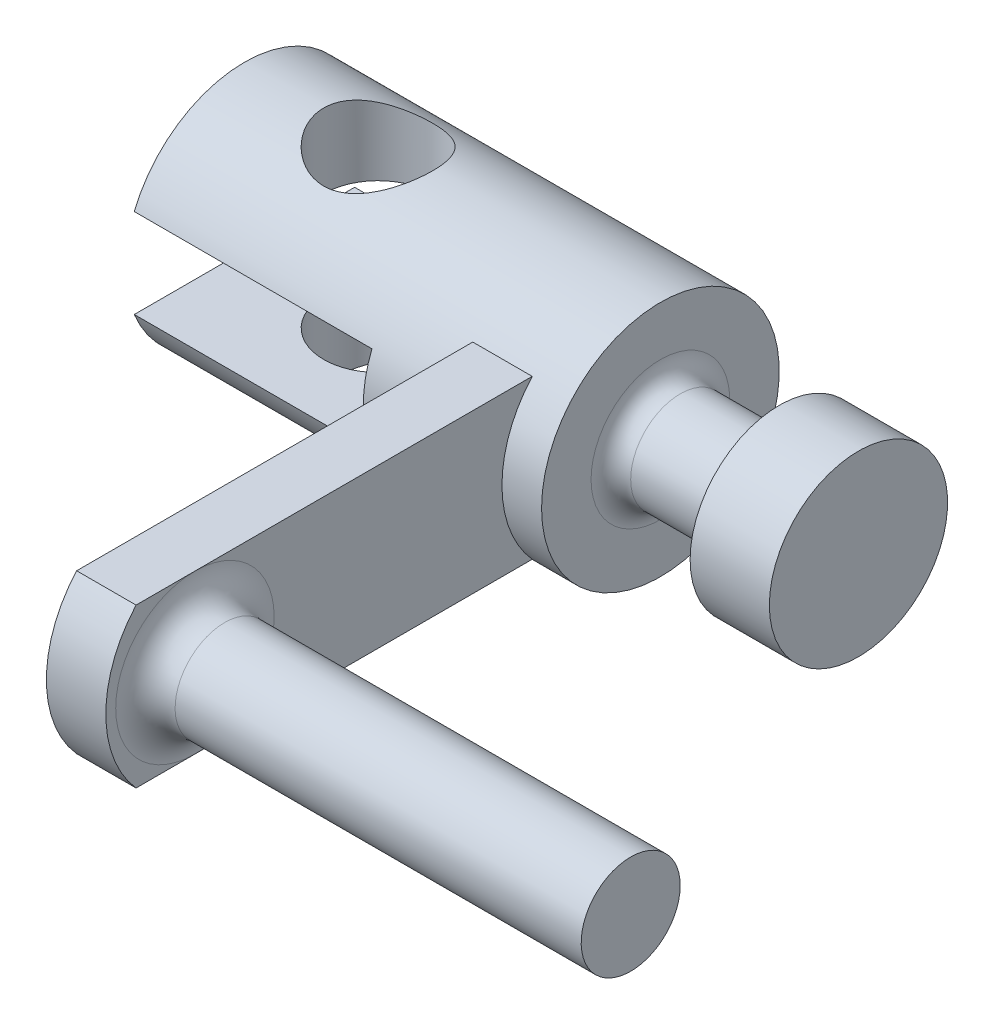
ISO-10303-21;
HEADER;
FILE_DESCRIPTION(('STEP AP214'),'2;1');
FILE_NAME('part.step','',(''),(''),'','','');
FILE_SCHEMA(('AUTOMOTIVE_DESIGN { 1 0 10303 214 1 1 1 1 }'));
ENDSEC;
DATA;
#1=APPLICATION_CONTEXT('core data for automotive mechanical design processes');
#2=APPLICATION_PROTOCOL_DEFINITION('international standard','automotive_design',2000,#1);
#3=PRODUCT_CONTEXT('',#1,'mechanical');
#4=PRODUCT('Part','Part','',(#3));
#5=PRODUCT_RELATED_PRODUCT_CATEGORY('part','',(#4));
#6=PRODUCT_DEFINITION_FORMATION('','',#4);
#7=PRODUCT_DEFINITION_CONTEXT('part definition',#1,'design');
#8=PRODUCT_DEFINITION('design','',#6,#7);
#9=PRODUCT_DEFINITION_SHAPE('','',#8);
#10=(LENGTH_UNIT() NAMED_UNIT(*) SI_UNIT(.MILLI.,.METRE.));
#11=(NAMED_UNIT(*) PLANE_ANGLE_UNIT() SI_UNIT($,.RADIAN.));
#12=(NAMED_UNIT(*) SI_UNIT($,.STERADIAN.) SOLID_ANGLE_UNIT());
#13=UNCERTAINTY_MEASURE_WITH_UNIT(LENGTH_MEASURE(1.E-05),#10,'distance_accuracy_value','');
#14=(GEOMETRIC_REPRESENTATION_CONTEXT(3) GLOBAL_UNCERTAINTY_ASSIGNED_CONTEXT((#13)) GLOBAL_UNIT_ASSIGNED_CONTEXT((#10,
#11,#12)) REPRESENTATION_CONTEXT('',''));
#15=CARTESIAN_POINT('',(0.,0.,0.));
#16=DIRECTION('',(0.,0.,1.));
#17=DIRECTION('',(1.,0.,0.));
#18=AXIS2_PLACEMENT_3D('',#15,#16,#17);
#19=CARTESIAN_POINT('',(-12.,4.,4.47213595499958));
#20=DIRECTION('',(1.,0.,0.));
#21=DIRECTION('',(0.,1.,0.));
#22=AXIS2_PLACEMENT_3D('',#19,#20,#21);
#23=PLANE('',#22);
#24=DIRECTION('',(0.,0.,1.));
#25=VECTOR('',#24,1.);
#26=CARTESIAN_POINT('',(-12.,-4.,4.47213595499958));
#27=LINE('',#26,#25);
#28=CARTESIAN_POINT('',(-12.,-4.,21.5));
#29=VERTEX_POINT('',#28);
#30=CARTESIAN_POINT('',(-12.,-4.,24.4721359549996));
#31=VERTEX_POINT('',#30);
#32=EDGE_CURVE('E129',#29,#31,#27,.T.);
#33=ORIENTED_EDGE('',*,*,#32,.F.);
#34=CARTESIAN_POINT('',(-12.,0.,21.5));
#35=DIRECTION('',(1.,0.,0.));
#36=DIRECTION('',(0.,1.,0.));
#37=AXIS2_PLACEMENT_3D('',#34,#35,#36);
#38=CIRCLE('',#37,4.);
#39=CARTESIAN_POINT('',(-12.,4.,21.5));
#40=VERTEX_POINT('',#39);
#41=EDGE_CURVE('E11',#29,#40,#38,.F.);
#42=ORIENTED_EDGE('',*,*,#41,.T.);
#43=DIRECTION('',(0.,0.,1.));
#44=VECTOR('',#43,1.);
#45=CARTESIAN_POINT('',(-12.,4.,4.47213595499958));
#46=LINE('',#45,#44);
#47=CARTESIAN_POINT('',(-12.,3.99999999999999,24.4721359549996));
#48=VERTEX_POINT('',#47);
#49=EDGE_CURVE('E122',#40,#48,#46,.T.);
#50=ORIENTED_EDGE('',*,*,#49,.T.);
#51=CARTESIAN_POINT('',(-12.,0.,20.));
#52=DIRECTION('',(-1.,0.,0.));
#53=DIRECTION('',(0.,-1.,0.));
#54=AXIS2_PLACEMENT_3D('',#51,#52,#53);
#55=CIRCLE('',#54,6.);
#56=EDGE_CURVE('E162',#31,#48,#55,.T.);
#57=ORIENTED_EDGE('',*,*,#56,.F.);
#58=EDGE_LOOP('',(#33,#42,#50,#57));
#59=FACE_BOUND('',#58,.T.);
#60=ADVANCED_FACE('F43',(#59),#23,.T.);
#61=CARTESIAN_POINT('',(-31.,0.,-6.));
#62=DIRECTION('',(1.,0.,0.));
#63=DIRECTION('',(0.,0.,-1.));
#64=AXIS2_PLACEMENT_3D('',#61,#62,#63);
#65=PLANE('',#64);
#66=CARTESIAN_POINT('',(-31.,0.,0.));
#67=DIRECTION('',(-1.,0.,0.));
#68=DIRECTION('',(0.,0.,1.));
#69=AXIS2_PLACEMENT_3D('',#66,#67,#68);
#70=CIRCLE('',#69,6.);
#71=CARTESIAN_POINT('',(-31.,-2.25,-5.56214886532175));
#72=VERTEX_POINT('',#71);
#73=CARTESIAN_POINT('',(-31.,-2.25,5.56214886532174));
#74=VERTEX_POINT('',#73);
#75=EDGE_CURVE('E521',#72,#74,#70,.T.);
#76=ORIENTED_EDGE('',*,*,#75,.T.);
#77=DIRECTION('',(0.,0.,-1.));
#78=VECTOR('',#77,1.);
#79=CARTESIAN_POINT('',(-31.,-2.25,-6.));
#80=LINE('',#79,#78);
#81=EDGE_CURVE('E475',#74,#72,#80,.T.);
#82=ORIENTED_EDGE('',*,*,#81,.T.);
#83=EDGE_LOOP('',(#76,#82));
#84=FACE_BOUND('',#83,.T.);
#85=ADVANCED_FACE('F217',(#84),#65,.F.);
#86=CARTESIAN_POINT('',(0.,0.,0.));
#87=DIRECTION('',(-1.,0.,0.));
#88=DIRECTION('',(0.,0.,1.));
#89=AXIS2_PLACEMENT_3D('',#86,#87,#88);
#90=PLANE('',#89);
#91=CARTESIAN_POINT('',(0.,0.,0.));
#92=DIRECTION('',(-1.,0.,0.));
#93=DIRECTION('',(0.,0.,1.));
#94=AXIS2_PLACEMENT_3D('',#91,#92,#93);
#95=CIRCLE('',#94,4.5);
#96=CARTESIAN_POINT('',(0.,0.,4.5));
#97=VERTEX_POINT('',#96);
#98=EDGE_CURVE('E466',#97,#97,#95,.T.);
#99=ORIENTED_EDGE('',*,*,#98,.F.);
#100=EDGE_LOOP('',(#99));
#101=FACE_BOUND('',#100,.T.);
#102=ADVANCED_FACE('F224',(#101),#90,.F.);
#103=CARTESIAN_POINT('',(-13.3084677419355,0.,0.));
#104=DIRECTION('',(-1.,0.,0.));
#105=DIRECTION('',(0.,0.,1.));
#106=AXIS2_PLACEMENT_3D('',#103,#104,#105);
#107=CYLINDRICAL_SURFACE('',#106,4.5);
#108=CARTESIAN_POINT('',(-4.,0.,0.));
#109=DIRECTION('',(-1.,0.,0.));
#110=DIRECTION('',(0.,0.,1.));
#111=AXIS2_PLACEMENT_3D('',#108,#109,#110);
#112=CIRCLE('',#111,4.5);
#113=CARTESIAN_POINT('',(-4.,0.,4.5));
#114=VERTEX_POINT('',#113);
#115=EDGE_CURVE('E470',#114,#114,#112,.T.);
#116=ORIENTED_EDGE('',*,*,#115,.F.);
#117=EDGE_LOOP('',(#116));
#118=FACE_BOUND('',#117,.T.);
#119=ORIENTED_EDGE('',*,*,#98,.T.);
#120=EDGE_LOOP('',(#119));
#121=FACE_BOUND('',#120,.T.);
#122=ADVANCED_FACE('F433',(#118,#121),#107,.T.);
#123=CARTESIAN_POINT('',(-4.,0.,-4.5));
#124=DIRECTION('',(1.,0.,0.));
#125=DIRECTION('',(0.,0.,-1.));
#126=AXIS2_PLACEMENT_3D('',#123,#124,#125);
#127=PLANE('',#126);
#128=CARTESIAN_POINT('',(-4.,0.,0.));
#129=DIRECTION('',(-1.,0.,0.));
#130=DIRECTION('',(0.,0.,1.));
#131=AXIS2_PLACEMENT_3D('',#128,#129,#130);
#132=CIRCLE('',#131,2.5);
#133=CARTESIAN_POINT('',(-4.,0.,2.5));
#134=VERTEX_POINT('',#133);
#135=EDGE_CURVE('E478',#134,#134,#132,.T.);
#136=ORIENTED_EDGE('',*,*,#135,.F.);
#137=EDGE_LOOP('',(#136));
#138=FACE_BOUND('',#137,.T.);
#139=ORIENTED_EDGE('',*,*,#115,.T.);
#140=EDGE_LOOP('',(#139));
#141=FACE_BOUND('',#140,.T.);
#142=ADVANCED_FACE('F321',(#138,#141),#127,.F.);
#143=CARTESIAN_POINT('',(-13.3084677419355,0.,0.));
#144=DIRECTION('',(-1.,0.,0.));
#145=DIRECTION('',(0.,0.,1.));
#146=AXIS2_PLACEMENT_3D('',#143,#144,#145);
#147=CYLINDRICAL_SURFACE('',#146,2.5);
#148=CARTESIAN_POINT('',(-9.,0.,0.));
#149=DIRECTION('',(-1.,0.,0.));
#150=DIRECTION('',(0.,0.,1.));
#151=AXIS2_PLACEMENT_3D('',#148,#149,#150);
#152=CIRCLE('',#151,2.5);
#153=CARTESIAN_POINT('',(-9.,0.,2.5));
#154=VERTEX_POINT('',#153);
#155=EDGE_CURVE('E493',#154,#154,#152,.F.);
#156=ORIENTED_EDGE('',*,*,#155,.T.);
#157=EDGE_LOOP('',(#156));
#158=FACE_BOUND('',#157,.T.);
#159=ORIENTED_EDGE('',*,*,#135,.T.);
#160=EDGE_LOOP('',(#159));
#161=FACE_BOUND('',#160,.T.);
#162=ADVANCED_FACE('F317',(#158,#161),#147,.T.);
#163=CARTESIAN_POINT('',(-10.,0.,-2.5));
#164=DIRECTION('',(-1.,0.,0.));
#165=DIRECTION('',(0.,0.,1.));
#166=AXIS2_PLACEMENT_3D('',#163,#164,#165);
#167=PLANE('',#166);
#168=CARTESIAN_POINT('',(-10.,0.,0.));
#169=DIRECTION('',(-1.,0.,0.));
#170=DIRECTION('',(0.,0.,1.));
#171=AXIS2_PLACEMENT_3D('',#168,#169,#170);
#172=CIRCLE('',#171,3.5);
#173=CARTESIAN_POINT('',(-10.,0.,3.5));
#174=VERTEX_POINT('',#173);
#175=EDGE_CURVE('E489',#174,#174,#172,.T.);
#176=ORIENTED_EDGE('',*,*,#175,.T.);
#177=EDGE_LOOP('',(#176));
#178=FACE_BOUND('',#177,.T.);
#179=CARTESIAN_POINT('',(-10.,0.,0.));
#180=DIRECTION('',(-1.,0.,0.));
#181=DIRECTION('',(0.,0.,1.));
#182=AXIS2_PLACEMENT_3D('',#179,#180,#181);
#183=CIRCLE('',#182,6.);
#184=CARTESIAN_POINT('',(-10.,0.,6.));
#185=VERTEX_POINT('',#184);
#186=EDGE_CURVE('E534',#185,#185,#183,.T.);
#187=ORIENTED_EDGE('',*,*,#186,.F.);
#188=EDGE_LOOP('',(#187));
#189=FACE_BOUND('',#188,.T.);
#190=ADVANCED_FACE('F221',(#178,#189),#167,.F.);
#191=CARTESIAN_POINT('',(-13.3084677419355,0.,0.));
#192=DIRECTION('',(-1.,0.,0.));
#193=DIRECTION('',(0.,0.,1.));
#194=AXIS2_PLACEMENT_3D('',#191,#192,#193);
#195=CYLINDRICAL_SURFACE('',#194,6.);
#196=DIRECTION('',(-1.,0.,0.));
#197=VECTOR('',#196,1.);
#198=CARTESIAN_POINT('',(-13.3084677419355,4.,4.47213595499958));
#199=LINE('',#198,#197);
#200=CARTESIAN_POINT('',(-12.,4.,4.47213595499958));
#201=VERTEX_POINT('',#200);
#202=CARTESIAN_POINT('',(-15.,3.99999999999999,4.47213595499958));
#203=VERTEX_POINT('',#202);
#204=EDGE_CURVE('E119',#201,#203,#199,.T.);
#205=ORIENTED_EDGE('',*,*,#204,.F.);
#206=CARTESIAN_POINT('',(-12.,0.,0.));
#207=DIRECTION('',(-1.,0.,0.));
#208=DIRECTION('',(0.,-1.,0.));
#209=AXIS2_PLACEMENT_3D('',#206,#207,#208);
#210=CIRCLE('',#209,6.);
#211=CARTESIAN_POINT('',(-12.,-4.,4.47213595499958));
#212=VERTEX_POINT('',#211);
#213=EDGE_CURVE('E112',#212,#201,#210,.T.);
#214=ORIENTED_EDGE('',*,*,#213,.F.);
#215=DIRECTION('',(-1.,0.,0.));
#216=VECTOR('',#215,1.);
#217=CARTESIAN_POINT('',(-13.3084677419355,-4.,4.47213595499958));
#218=LINE('',#217,#216);
#219=CARTESIAN_POINT('',(-15.,-4.,4.47213595499958));
#220=VERTEX_POINT('',#219);
#221=EDGE_CURVE('E116',#212,#220,#218,.T.);
#222=ORIENTED_EDGE('',*,*,#221,.T.);
#223=CARTESIAN_POINT('',(-15.,0.,0.));
#224=DIRECTION('',(1.,0.,0.));
#225=DIRECTION('',(0.,0.,-1.));
#226=AXIS2_PLACEMENT_3D('',#223,#224,#225);
#227=CIRCLE('',#226,6.);
#228=EDGE_CURVE('E149',#203,#220,#227,.T.);
#229=ORIENTED_EDGE('',*,*,#228,.F.);
#230=EDGE_LOOP('',(#205,#214,#222,#229));
#231=FACE_BOUND('',#230,.T.);
#232=CARTESIAN_POINT('',(-27.,-6.,0.));
#233=CARTESIAN_POINT('',(-26.9999912961116,-5.99999285624569,0.145974227100079));
#234=CARTESIAN_POINT('',(-26.9883079687476,-5.99461344969342,0.292168614341585));
#235=CARTESIAN_POINT('',(-26.9420475155607,-5.97362621907722,0.580321879872874));
#236=CARTESIAN_POINT('',(-26.9074180122934,-5.95799499482463,0.722270289630445));
#237=CARTESIAN_POINT('',(-26.8168554693923,-5.91815898458901,0.997313063866765));
#238=CARTESIAN_POINT('',(-26.7610002518078,-5.89398554026955,1.13043771039469));
#239=CARTESIAN_POINT('',(-26.6299318945222,-5.83935231640849,1.38526949285144));
#240=CARTESIAN_POINT('',(-26.5547224374408,-5.80889373298723,1.50697879482536));
#241=CARTESIAN_POINT('',(-26.3824870751646,-5.74267808763627,1.74282567672531));
#242=CARTESIAN_POINT('',(-26.2845127594333,-5.70672525701042,1.85621502873833));
#243=CARTESIAN_POINT('',(-26.0715480891655,-5.63431549221796,2.06562060716264));
#244=CARTESIAN_POINT('',(-25.9565470241305,-5.59785825394064,2.16162581313924));
#245=CARTESIAN_POINT('',(-25.7041448867514,-5.52598652132146,2.33949763387027));
#246=CARTESIAN_POINT('',(-25.5657942846685,-5.49077874162965,2.42010961946554));
#247=CARTESIAN_POINT('',(-25.2756748974778,-5.42858377774875,2.55658829345862));
#248=CARTESIAN_POINT('',(-25.1239144757049,-5.40159151581228,2.61247027641269));
#249=CARTESIAN_POINT('',(-24.8198559071101,-5.36104741962166,2.69465764507304));
#250=CARTESIAN_POINT('',(-24.6680407507441,-5.34684146569753,2.72241297665656));
#251=CARTESIAN_POINT('',(-24.3612960767505,-5.33165081426984,2.75205526971009));
#252=CARTESIAN_POINT('',(-24.2063689338031,-5.3306563925384,2.75396125737568));
#253=CARTESIAN_POINT('',(-23.9138037247483,-5.34145986948393,2.73292718459751));
#254=CARTESIAN_POINT('',(-23.775939454173,-5.35203309817852,2.71236599181203));
#255=CARTESIAN_POINT('',(-23.5058919277998,-5.38267392029549,2.65103453596601));
#256=CARTESIAN_POINT('',(-23.3737100678864,-5.40274383220447,2.61025933781386));
#257=CARTESIAN_POINT('',(-23.1151462484286,-5.45058234155423,2.5088530409151));
#258=CARTESIAN_POINT('',(-22.9889660474083,-5.47851649850035,2.44778919683436));
#259=CARTESIAN_POINT('',(-22.7480901622206,-5.53891779292472,2.30785393809594));
#260=CARTESIAN_POINT('',(-22.6333994663275,-5.57138688476546,2.22897483673399));
#261=CARTESIAN_POINT('',(-22.406164694757,-5.64130676856698,2.04602125851287));
#262=CARTESIAN_POINT('',(-22.2950921827368,-5.67892393650109,1.94017698629255));
#263=CARTESIAN_POINT('',(-22.0917215169422,-5.75209970703169,1.71108285967776));
#264=CARTESIAN_POINT('',(-21.9994297677068,-5.78765760443676,1.58782709188083));
#265=CARTESIAN_POINT('',(-21.8334326385591,-5.85417071036373,1.32213023021257));
#266=CARTESIAN_POINT('',(-21.7604469767293,-5.88493365620428,1.17918763034504));
#267=CARTESIAN_POINT('',(-21.6400952679497,-5.93684579662981,0.881280922866591));
#268=CARTESIAN_POINT('',(-21.5927120406373,-5.958001436616,0.72632495679525));
#269=CARTESIAN_POINT('',(-21.5282695961487,-5.98703237694658,0.42097675257108));
#270=CARTESIAN_POINT('',(-21.5092433059414,-5.99576698376909,0.271081706964737));
#271=CARTESIAN_POINT('',(-21.4960426343062,-6.00181121374038,-0.0300061640852818));
#272=CARTESIAN_POINT('',(-21.5018590772941,-5.99912505511416,-0.181198489794864));
#273=CARTESIAN_POINT('',(-21.5368876847648,-5.98316536241069,-0.470567421119453));
#274=CARTESIAN_POINT('',(-21.5646114006939,-5.9705656149117,-0.608966058558463));
#275=CARTESIAN_POINT('',(-21.6404711807528,-5.93683336519802,-0.878934990818992));
#276=CARTESIAN_POINT('',(-21.6886096692289,-5.9156998495741,-1.01050447256395));
#277=CARTESIAN_POINT('',(-21.8054225418526,-5.86605346752342,-1.26771973255845));
#278=CARTESIAN_POINT('',(-21.874685963613,-5.83733260494656,-1.39305649101858));
#279=CARTESIAN_POINT('',(-22.0311401853874,-5.77543766649923,-1.63077661353608));
#280=CARTESIAN_POINT('',(-22.1183388577915,-5.74226163733214,-1.74315425547768));
#281=CARTESIAN_POINT('',(-22.3168163328123,-5.67145408306658,-1.96186686948593));
#282=CARTESIAN_POINT('',(-22.4295130884648,-5.63368368576965,-2.06687315004879));
#283=CARTESIAN_POINT('',(-22.6713112490247,-5.56026089273765,-2.25696829291393));
#284=CARTESIAN_POINT('',(-22.8004196592139,-5.52460941105069,-2.34204860551513));
#285=CARTESIAN_POINT('',(-23.0763109790346,-5.45862917983751,-2.49204663609089));
#286=CARTESIAN_POINT('',(-23.2234969673584,-5.42848411928952,-2.55631030457525));
#287=CARTESIAN_POINT('',(-23.5284379257528,-5.37918590572911,-2.65850210887561));
#288=CARTESIAN_POINT('',(-23.6861815137262,-5.36002112150874,-2.69645812089145));
#289=CARTESIAN_POINT('',(-23.9927874695844,-5.33688939427145,-2.74193420256819));
#290=CARTESIAN_POINT('',(-24.1412053659458,-5.33173067139581,-2.75184429261221));
#291=CARTESIAN_POINT('',(-24.437582784698,-5.33392484343868,-2.74759135438456));
#292=CARTESIAN_POINT('',(-24.5855424135529,-5.34127457339124,-2.73343441570209));
#293=CARTESIAN_POINT('',(-24.8663212609615,-5.36647766169563,-2.68358059332723));
#294=CARTESIAN_POINT('',(-24.9994862402212,-5.3835836631637,-2.64941210267081));
#295=CARTESIAN_POINT('',(-25.2581488237028,-5.42563837203848,-2.56218256587872));
#296=CARTESIAN_POINT('',(-25.3836441597092,-5.45058938624729,-2.50911596220095));
#297=CARTESIAN_POINT('',(-25.6324352491101,-5.50753971938645,-2.38163283064396));
#298=CARTESIAN_POINT('',(-25.7550475591309,-5.53989385160341,-2.30604480720991));
#299=CARTESIAN_POINT('',(-25.9865859269309,-5.60722181290222,-2.1371311245057));
#300=CARTESIAN_POINT('',(-26.0955057966301,-5.64219681512918,-2.04379749292266));
#301=CARTESIAN_POINT('',(-26.3073223883782,-5.71482673024118,-1.83152378216016));
#302=CARTESIAN_POINT('',(-26.4086530727955,-5.75241897381888,-1.71099025374101));
#303=CARTESIAN_POINT('',(-26.5898571204278,-5.82283886233574,-1.45340638064399));
#304=CARTESIAN_POINT('',(-26.6697204720015,-5.85566428091861,-1.31634837251625));
#305=CARTESIAN_POINT('',(-26.8046670130551,-5.91270565802669,-1.03002582293454));
#306=CARTESIAN_POINT('',(-26.8599381469024,-5.93698660739551,-0.880864537332218));
#307=CARTESIAN_POINT('',(-26.9230038839497,-5.96507506461454,-0.65106032766299));
#308=CARTESIAN_POINT('',(-26.9407127773571,-5.97304603307841,-0.573512339310589));
#309=CARTESIAN_POINT('',(-26.9693692389908,-5.98600858813426,-0.41694846164506));
#310=CARTESIAN_POINT('',(-26.9803213681441,-5.99100218442496,-0.337933599688639));
#311=CARTESIAN_POINT('',(-26.9918747332151,-5.99627932300574,-0.215605696117648));
#312=CARTESIAN_POINT('',(-26.9949196404164,-5.99767273135271,-0.17255453971092));
#313=CARTESIAN_POINT('',(-26.9989835782237,-5.99953413424265,-0.0863420116982964));
#314=CARTESIAN_POINT('',(-27.0000025746974,-6.00000211319407,-0.0431806382477413));
#315=CARTESIAN_POINT('',(-27.,-6.,0.));
#316=B_SPLINE_CURVE_WITH_KNOTS('',3,(#232,#233,#234,#235,#236,#237,#238,#239,#240,#241,#242,
#243,#244,#245,#246,#247,#248,#249,#250,#251,#252,#253,#254,#255,#256,#257,#258,#259,#260,#261,
#262,#263,#264,#265,#266,#267,#268,#269,#270,#271,#272,#273,#274,#275,#276,#277,#278,#279,#280,
#281,#282,#283,#284,#285,#286,#287,#288,#289,#290,#291,#292,#293,#294,#295,#296,#297,#298,#299,
#300,#301,#302,#303,#304,#305,#306,#307,#308,#309,#310,#311,#312,#313,#314,#315),.UNSPECIFIED.,
.T.,.F.,(4,2,2,2,2,2,2,2,2,2,2,2,2,2,2,2,2,2,2,2,2,2,2,2,2,2,2,2,2,2,2,2,2,2,2,2,2,2,2,2,2,4),
(0.,0.437754141052367,0.876510967438005,1.3136744164469,1.75075474579367,2.21110788659584,
2.67175184782025,3.16111458884534,3.65017425340656,4.11249673696635,4.5744789134061,
4.99189919161597,5.40942142995391,5.83649165508693,6.26374650035258,6.73556418298497,
7.20754249431486,7.69520810913114,8.18254607111749,8.63418492344596,9.08565697883159,
9.50884661306335,9.93208651705359,10.3684151766245,10.8049357659305,11.2786150141176,
11.7524971345903,12.2400799384891,12.7271452952703,13.1712342695151,13.615210894331,
14.0290308817074,14.4429726655693,14.8840490448588,15.3253240503886,15.808698867475,
16.2922987247196,16.7721364070951,17.0116762116357,17.251054145437,17.3805440226724,
17.5100360815225),.UNSPECIFIED.);
#317=CARTESIAN_POINT('',(-27.,-6.,0.));
#318=VERTEX_POINT('',#317);
#319=EDGE_CURVE('E185',#318,#318,#316,.T.);
#320=ORIENTED_EDGE('',*,*,#319,.T.);
#321=EDGE_LOOP('',(#320));
#322=FACE_BOUND('',#321,.T.);
#323=CARTESIAN_POINT('',(-24.25,5.33268225192539,2.75));
#324=CARTESIAN_POINT('',(-24.3950635459322,5.33269240567796,2.74999089974782));
#325=CARTESIAN_POINT('',(-24.5403545916575,5.33868897240783,2.73844695832226));
#326=CARTESIAN_POINT('',(-24.8266147923417,5.36185472035181,2.69279272500375));
#327=CARTESIAN_POINT('',(-24.9675725469994,5.37905110463362,2.65862748521375));
#328=CARTESIAN_POINT('',(-25.2405060587627,5.42222346533938,2.56941879793231));
#329=CARTESIAN_POINT('',(-25.372520348439,5.44815846131566,2.51447265954732));
#330=CARTESIAN_POINT('',(-25.6254242908691,5.50582380412398,2.38555515422783));
#331=CARTESIAN_POINT('',(-25.7463149716381,5.53755361460362,2.31158554779579));
#332=CARTESIAN_POINT('',(-25.9827505194177,5.60591109611835,2.14074299198114));
#333=CARTESIAN_POINT('',(-26.097356880869,5.64272551197859,2.04264530118519));
#334=CARTESIAN_POINT('',(-26.309202255288,5.71558440953657,1.82889130906421));
#335=CARTESIAN_POINT('',(-26.4064337002463,5.75162854973579,1.71322739678288));
#336=CARTESIAN_POINT('',(-26.5859231135053,5.82123840197497,1.4599092198328));
#337=CARTESIAN_POINT('',(-26.6670777030896,5.85456234972602,1.32140057432227));
#338=CARTESIAN_POINT('',(-26.8045156765585,5.91262681135656,1.03088752602924));
#339=CARTESIAN_POINT('',(-26.8608123108258,5.93737189663175,0.878890365239175));
#340=CARTESIAN_POINT('',(-26.9433858422871,5.97415665191446,0.575613394523673));
#341=CARTESIAN_POINT('',(-26.9712941302189,5.98688332002978,0.42486288483831));
#342=CARTESIAN_POINT('',(-27.001618806606,6.00072595072295,0.120319666318278));
#343=CARTESIAN_POINT('',(-27.0040478863859,6.0018476937698,-0.0334714897032851));
#344=CARTESIAN_POINT('',(-26.9840932236799,5.99272147616478,-0.327678650697175));
#345=CARTESIAN_POINT('',(-26.9635166832185,5.98330156282319,-0.468248198255063));
#346=CARTESIAN_POINT('',(-26.901297596579,5.9553429271712,-0.743679086777861));
#347=CARTESIAN_POINT('',(-26.8596534876355,5.93680352839175,-0.878540003479421));
#348=CARTESIAN_POINT('',(-26.7560668682936,5.89200006633101,-1.14121494125136));
#349=CARTESIAN_POINT('',(-26.6938278605262,5.86562378090373,-1.26889210416201));
#350=CARTESIAN_POINT('',(-26.5511531733007,5.80762962231517,-1.51232255893178));
#351=CARTESIAN_POINT('',(-26.4707108229363,5.77600982872423,-1.62807145679812));
#352=CARTESIAN_POINT('',(-26.2862268995547,5.70752067638136,-1.85454470704));
#353=CARTESIAN_POINT('',(-26.1807845099764,5.67043343694229,-1.96406346241015));
#354=CARTESIAN_POINT('',(-25.9531344729516,5.5970137983984,-2.16445114244316));
#355=CARTESIAN_POINT('',(-25.8309174973379,5.56068183232835,-2.25530961965231));
#356=CARTESIAN_POINT('',(-25.5661137941693,5.49113970847429,-2.41986509615478));
#357=CARTESIAN_POINT('',(-25.4228433361068,5.45815385266966,-2.49256534686327));
#358=CARTESIAN_POINT('',(-25.1241971902127,5.40188181843778,-2.61229754791748));
#359=CARTESIAN_POINT('',(-24.9688323540239,5.37858706111387,-2.659352212119));
#360=CARTESIAN_POINT('',(-24.6625026326125,5.34660672904655,-2.72304718313725));
#361=CARTESIAN_POINT('',(-24.5120502714004,5.33697528948749,-2.74166440393722));
#362=CARTESIAN_POINT('',(-24.2098949779348,5.33069829240682,-2.75385561991061));
#363=CARTESIAN_POINT('',(-24.058192691865,5.33404639936563,-2.74744183309991));
#364=CARTESIAN_POINT('',(-23.7714305665107,5.35235895392943,-2.71156462031207));
#365=CARTESIAN_POINT('',(-23.6360478104943,5.36631767375101,-2.68409516168259));
#366=CARTESIAN_POINT('',(-23.3719894673082,5.40289551804298,-2.60967922347848));
#367=CARTESIAN_POINT('',(-23.2433156998318,5.42551697838635,-2.56272749030164));
#368=CARTESIAN_POINT('',(-22.9897242234406,5.47810970280585,-2.44835336075155));
#369=CARTESIAN_POINT('',(-22.865245327249,5.50836907204843,-2.38009515534424));
#370=CARTESIAN_POINT('',(-22.6288397753946,5.57249390636962,-2.22582230461958));
#371=CARTESIAN_POINT('',(-22.5169192604113,5.60636111993681,-2.13979903059512));
#372=CARTESIAN_POINT('',(-22.2968600294856,5.67805816411089,-1.9421101041747));
#373=CARTESIAN_POINT('',(-22.190278849458,5.71593900946358,-1.82872168276023));
#374=CARTESIAN_POINT('',(-21.9972757290274,5.78828567164951,-1.5849002186847));
#375=CARTESIAN_POINT('',(-21.9108574703489,5.82275086412885,-1.45446406990304));
#376=CARTESIAN_POINT('',(-21.7599241761483,5.88499652738708,-1.17776944792661));
#377=CARTESIAN_POINT('',(-21.6956898268802,5.91269012531723,-1.03133703842932));
#378=CARTESIAN_POINT('',(-21.5933313333388,5.95762160220848,-0.728122991606424));
#379=CARTESIAN_POINT('',(-21.555188036846,5.9748671495288,-0.571349038412835));
#380=CARTESIAN_POINT('',(-21.5088596750912,5.99591279051023,-0.26566472822202));
#381=CARTESIAN_POINT('',(-21.4984912589153,6.00069195005236,-0.117151185749876));
#382=CARTESIAN_POINT('',(-21.501862426775,5.99914594824383,0.179524457186989));
#383=CARTESIAN_POINT('',(-21.5155960229661,5.99282354493788,0.327686635786896));
#384=CARTESIAN_POINT('',(-21.5652395474001,5.97034243502802,0.61183866091207));
#385=CARTESIAN_POINT('',(-21.6000231119251,5.9546838874388,0.748068528666646));
#386=CARTESIAN_POINT('',(-21.6894154961605,5.91544458790274,1.01262735219517));
#387=CARTESIAN_POINT('',(-21.7440276351904,5.89186250959974,1.14095498091866));
#388=CARTESIAN_POINT('',(-21.874242833698,5.83764202490644,1.39257166129431));
#389=CARTESIAN_POINT('',(-21.9506902304955,5.80673066816011,1.51536337205));
#390=CARTESIAN_POINT('',(-22.1212698559078,5.7413227383623,1.74691536272492));
#391=CARTESIAN_POINT('',(-22.2154098921231,5.70682458550476,1.85566941207534));
#392=CARTESIAN_POINT('',(-22.4279786709475,5.63440062136612,2.06564306563152));
#393=CARTESIAN_POINT('',(-22.5477845376493,5.59643062118521,2.16545897514086));
#394=CARTESIAN_POINT('',(-22.8033329564687,5.52406671580594,2.3439244644378));
#395=CARTESIAN_POINT('',(-22.9390861559752,5.48967522905964,2.4225597861258));
#396=CARTESIAN_POINT('',(-23.2250329693289,5.42849038593072,2.55676358045106));
#397=CARTESIAN_POINT('',(-23.3753527501209,5.40177317600175,2.61210326049767));
#398=CARTESIAN_POINT('',(-23.6070837392114,5.37074852191698,2.67499179098269));
#399=CARTESIAN_POINT('',(-23.6852938166046,5.36191950662766,2.69259410262058));
#400=CARTESIAN_POINT('',(-23.8432308116064,5.34759795990105,2.72092929966693));
#401=CARTESIAN_POINT('',(-23.9229565640575,5.34210296456927,2.73166725825828));
#402=CARTESIAN_POINT('',(-24.0440776919339,5.33649887873648,2.74258907905106));
#403=CARTESIAN_POINT('',(-24.0851977250933,5.33507007021701,2.74536614910188));
#404=CARTESIAN_POINT('',(-24.1675390408109,5.3331602950894,2.74907293904268));
#405=CARTESIAN_POINT('',(-24.2087603272447,5.33267936534605,2.75000258708292));
#406=CARTESIAN_POINT('',(-24.25,5.33268225192539,2.75));
#407=B_SPLINE_CURVE_WITH_KNOTS('',3,(#323,#324,#325,#326,#327,#328,#329,#330,#331,#332,#333,
#334,#335,#336,#337,#338,#339,#340,#341,#342,#343,#344,#345,#346,#347,#348,#349,#350,#351,#352,
#353,#354,#355,#356,#357,#358,#359,#360,#361,#362,#363,#364,#365,#366,#367,#368,#369,#370,#371,
#372,#373,#374,#375,#376,#377,#378,#379,#380,#381,#382,#383,#384,#385,#386,#387,#388,#389,#390,
#391,#392,#393,#394,#395,#396,#397,#398,#399,#400,#401,#402,#403,#404,#405,#406),.UNSPECIFIED.,
.T.,.F.,(4,2,2,2,2,2,2,2,2,2,2,2,2,2,2,2,2,2,2,2,2,2,2,2,2,2,2,2,2,2,2,2,2,2,2,2,2,2,2,2,2,4),
(0.,0.435025184793795,0.871110956156601,1.3051794896826,1.73920786733849,2.20306746639142,
2.66712861934015,3.15645428708823,3.64551880694316,4.10454598240084,4.56334450319905,
4.98848545314728,5.41365794413822,5.84523908042299,6.27697863339427,6.74439493671584,
7.21207222635557,7.70153815135543,8.19056985737739,8.64374802938477,9.09670502590031,
9.5113782073755,9.92616328262154,10.3598619512961,10.7937717701663,11.2720604343287,
11.7504363651816,12.2346605232229,12.7185288524518,13.1630614956571,13.6074837159008,
14.0300017534536,14.4525905535047,14.8944681366133,15.3365411760923,15.8158071248115,
16.2953948983871,16.779588740277,17.021237556866,17.262707572875,17.3863747454555,
17.5100467275921),.UNSPECIFIED.);
#408=CARTESIAN_POINT('',(-24.25,5.33268225192539,2.75));
#409=VERTEX_POINT('',#408);
#410=EDGE_CURVE('E176',#409,#409,#407,.T.);
#411=ORIENTED_EDGE('',*,*,#410,.T.);
#412=EDGE_LOOP('',(#411));
#413=FACE_BOUND('',#412,.T.);
#414=ORIENTED_EDGE('',*,*,#75,.F.);
#415=DIRECTION('',(-1.,0.,0.));
#416=VECTOR('',#415,1.);
#417=CARTESIAN_POINT('',(-13.3084677419355,-2.25,-5.56214886532175));
#418=LINE('',#417,#416);
#419=CARTESIAN_POINT('',(-19.,-2.25,-5.56214886532175));
#420=VERTEX_POINT('',#419);
#421=EDGE_CURVE('E512',#72,#420,#418,.F.);
#422=ORIENTED_EDGE('',*,*,#421,.T.);
#423=CARTESIAN_POINT('',(-19.,0.,0.));
#424=DIRECTION('',(-1.,0.,0.));
#425=DIRECTION('',(0.,0.,1.));
#426=AXIS2_PLACEMENT_3D('',#423,#424,#425);
#427=CIRCLE('',#426,6.);
#428=CARTESIAN_POINT('',(-19.,2.25,-5.56214886532175));
#429=VERTEX_POINT('',#428);
#430=EDGE_CURVE('E487',#429,#420,#427,.T.);
#431=ORIENTED_EDGE('',*,*,#430,.F.);
#432=DIRECTION('',(-1.,0.,0.));
#433=VECTOR('',#432,1.);
#434=CARTESIAN_POINT('',(-13.3084677419355,2.25,-5.56214886532175));
#435=LINE('',#434,#433);
#436=CARTESIAN_POINT('',(-31.,2.25,-5.56214886532175));
#437=VERTEX_POINT('',#436);
#438=EDGE_CURVE('E523',#429,#437,#435,.T.);
#439=ORIENTED_EDGE('',*,*,#438,.T.);
#440=CARTESIAN_POINT('',(-31.,2.25,5.56214886532175));
#441=VERTEX_POINT('',#440);
#442=EDGE_CURVE('E531',#441,#437,#70,.T.);
#443=ORIENTED_EDGE('',*,*,#442,.F.);
#444=DIRECTION('',(-1.,0.,0.));
#445=VECTOR('',#444,1.);
#446=CARTESIAN_POINT('',(-13.3084677419355,2.25,5.56214886532175));
#447=LINE('',#446,#445);
#448=CARTESIAN_POINT('',(-19.,2.25,5.56214886532175));
#449=VERTEX_POINT('',#448);
#450=EDGE_CURVE('E516',#441,#449,#447,.F.);
#451=ORIENTED_EDGE('',*,*,#450,.T.);
#452=CARTESIAN_POINT('',(-19.,-2.25,5.56214886532175));
#453=VERTEX_POINT('',#452);
#454=EDGE_CURVE('E485',#453,#449,#427,.T.);
#455=ORIENTED_EDGE('',*,*,#454,.F.);
#456=DIRECTION('',(-1.,0.,0.));
#457=VECTOR('',#456,1.);
#458=CARTESIAN_POINT('',(-13.3084677419355,-2.25,5.56214886532175));
#459=LINE('',#458,#457);
#460=EDGE_CURVE('E514',#453,#74,#459,.T.);
#461=ORIENTED_EDGE('',*,*,#460,.T.);
#462=EDGE_LOOP('',(#414,#422,#431,#439,#443,#451,#455,#461));
#463=FACE_BOUND('',#462,.T.);
#464=ORIENTED_EDGE('',*,*,#186,.T.);
#465=EDGE_LOOP('',(#464));
#466=FACE_BOUND('',#465,.T.);
#467=ADVANCED_FACE('F113',(#231,#322,#413,#463,#466),#195,.T.);
#468=ORIENTED_EDGE('',*,*,#442,.T.);
#469=DIRECTION('',(0.,0.,1.));
#470=VECTOR('',#469,1.);
#471=CARTESIAN_POINT('',(-31.,2.25,-6.));
#472=LINE('',#471,#470);
#473=EDGE_CURVE('E469',#437,#441,#472,.T.);
#474=ORIENTED_EDGE('',*,*,#473,.T.);
#475=EDGE_LOOP('',(#468,#474));
#476=FACE_BOUND('',#475,.T.);
#477=ADVANCED_FACE('F207',(#476),#65,.F.);
#478=CARTESIAN_POINT('',(-19.,0.,0.));
#479=DIRECTION('',(-1.,0.,0.));
#480=DIRECTION('',(0.,0.,1.));
#481=AXIS2_PLACEMENT_3D('',#478,#479,#480);
#482=PLANE('',#481);
#483=ORIENTED_EDGE('',*,*,#430,.T.);
#484=DIRECTION('',(0.,0.,1.));
#485=VECTOR('',#484,1.);
#486=CARTESIAN_POINT('',(-19.,-2.25,-10.4349932417522));
#487=LINE('',#486,#485);
#488=EDGE_CURVE('E504',#420,#453,#487,.T.);
#489=ORIENTED_EDGE('',*,*,#488,.T.);
#490=ORIENTED_EDGE('',*,*,#454,.T.);
#491=DIRECTION('',(0.,0.,-1.));
#492=VECTOR('',#491,1.);
#493=CARTESIAN_POINT('',(-19.,2.25,-10.4349932417522));
#494=LINE('',#493,#492);
#495=EDGE_CURVE('E507',#449,#429,#494,.T.);
#496=ORIENTED_EDGE('',*,*,#495,.T.);
#497=EDGE_LOOP('',(#483,#489,#490,#496));
#498=FACE_BOUND('',#497,.T.);
#499=ADVANCED_FACE('F202',(#498),#482,.T.);
#500=CARTESIAN_POINT('',(-19.,-2.25,-10.4349932417522));
#501=DIRECTION('',(0.,-1.,0.));
#502=DIRECTION('',(0.,0.,-1.));
#503=AXIS2_PLACEMENT_3D('',#500,#501,#502);
#504=PLANE('',#503);
#505=CARTESIAN_POINT('',(-24.25,-2.25,0.));
#506=DIRECTION('',(0.,-1.,0.));
#507=DIRECTION('',(0.,0.,-1.));
#508=AXIS2_PLACEMENT_3D('',#505,#506,#507);
#509=CIRCLE('',#508,2.75);
#510=CARTESIAN_POINT('',(-24.25,-2.25,-2.75));
#511=VERTEX_POINT('',#510);
#512=EDGE_CURVE('E143',#511,#511,#509,.T.);
#513=ORIENTED_EDGE('',*,*,#512,.T.);
#514=EDGE_LOOP('',(#513));
#515=FACE_BOUND('',#514,.T.);
#516=ORIENTED_EDGE('',*,*,#488,.F.);
#517=ORIENTED_EDGE('',*,*,#421,.F.);
#518=ORIENTED_EDGE('',*,*,#81,.F.);
#519=ORIENTED_EDGE('',*,*,#460,.F.);
#520=EDGE_LOOP('',(#516,#517,#518,#519));
#521=FACE_BOUND('',#520,.T.);
#522=ADVANCED_FACE('F206',(#515,#521),#504,.F.);
#523=CARTESIAN_POINT('',(-19.,2.25,-10.4349932417522));
#524=DIRECTION('',(0.,1.,0.));
#525=DIRECTION('',(0.,0.,1.));
#526=AXIS2_PLACEMENT_3D('',#523,#524,#525);
#527=PLANE('',#526);
#528=CARTESIAN_POINT('',(-24.25,2.25,0.));
#529=DIRECTION('',(0.,1.,0.));
#530=DIRECTION('',(0.,0.,1.));
#531=AXIS2_PLACEMENT_3D('',#528,#529,#530);
#532=CIRCLE('',#531,2.75);
#533=CARTESIAN_POINT('',(-24.25,2.25,2.75));
#534=VERTEX_POINT('',#533);
#535=EDGE_CURVE('E137',#534,#534,#532,.T.);
#536=ORIENTED_EDGE('',*,*,#535,.T.);
#537=EDGE_LOOP('',(#536));
#538=FACE_BOUND('',#537,.T.);
#539=ORIENTED_EDGE('',*,*,#495,.F.);
#540=ORIENTED_EDGE('',*,*,#450,.F.);
#541=ORIENTED_EDGE('',*,*,#473,.F.);
#542=ORIENTED_EDGE('',*,*,#438,.F.);
#543=EDGE_LOOP('',(#539,#540,#541,#542));
#544=FACE_BOUND('',#543,.T.);
#545=ADVANCED_FACE('F211',(#538,#544),#527,.F.);
#546=CARTESIAN_POINT('',(-24.25,-6.,0.));
#547=DIRECTION('',(0.,1.,0.));
#548=DIRECTION('',(0.,0.,1.));
#549=AXIS2_PLACEMENT_3D('',#546,#547,#548);
#550=CYLINDRICAL_SURFACE('',#549,2.75);
#551=ORIENTED_EDGE('',*,*,#535,.F.);
#552=EDGE_LOOP('',(#551));
#553=FACE_BOUND('',#552,.T.);
#554=ORIENTED_EDGE('',*,*,#410,.F.);
#555=EDGE_LOOP('',(#554));
#556=FACE_BOUND('',#555,.T.);
#557=ADVANCED_FACE('F199',(#553,#556),#550,.F.);
#558=ORIENTED_EDGE('',*,*,#512,.F.);
#559=EDGE_LOOP('',(#558));
#560=FACE_BOUND('',#559,.T.);
#561=ORIENTED_EDGE('',*,*,#319,.F.);
#562=EDGE_LOOP('',(#561));
#563=FACE_BOUND('',#562,.T.);
#564=ADVANCED_FACE('F193',(#560,#563),#550,.F.);
#565=CARTESIAN_POINT('',(-13.3084677419355,0.,20.));
#566=DIRECTION('',(-1.,0.,0.));
#567=DIRECTION('',(0.,0.,1.));
#568=AXIS2_PLACEMENT_3D('',#565,#566,#567);
#569=CYLINDRICAL_SURFACE('',#568,6.);
#570=DIRECTION('',(-1.,0.,0.));
#571=VECTOR('',#570,1.);
#572=CARTESIAN_POINT('',(-13.3084677419355,-4.,24.4721359549996));
#573=LINE('',#572,#571);
#574=CARTESIAN_POINT('',(-15.,-4.,24.4721359549996));
#575=VERTEX_POINT('',#574);
#576=EDGE_CURVE('E138',#31,#575,#573,.T.);
#577=ORIENTED_EDGE('',*,*,#576,.F.);
#578=ORIENTED_EDGE('',*,*,#56,.T.);
#579=DIRECTION('',(-1.,0.,0.));
#580=VECTOR('',#579,1.);
#581=CARTESIAN_POINT('',(-13.3084677419355,4.,24.4721359549996));
#582=LINE('',#581,#580);
#583=CARTESIAN_POINT('',(-15.,3.99999999999999,24.4721359549996));
#584=VERTEX_POINT('',#583);
#585=EDGE_CURVE('E155',#48,#584,#582,.T.);
#586=ORIENTED_EDGE('',*,*,#585,.T.);
#587=CARTESIAN_POINT('',(-15.,0.,20.));
#588=DIRECTION('',(1.,0.,0.));
#589=DIRECTION('',(0.,0.,-1.));
#590=AXIS2_PLACEMENT_3D('',#587,#588,#589);
#591=CIRCLE('',#590,6.);
#592=EDGE_CURVE('E152',#584,#575,#591,.T.);
#593=ORIENTED_EDGE('',*,*,#592,.T.);
#594=EDGE_LOOP('',(#577,#578,#586,#593));
#595=FACE_BOUND('',#594,.T.);
#596=ADVANCED_FACE('F198',(#595),#569,.T.);
#597=EDGE_CURVE('E161',#201,#40,#46,.T.);
#598=ORIENTED_EDGE('',*,*,#597,.T.);
#599=CARTESIAN_POINT('',(-12.,0.,21.5));
#600=DIRECTION('',(1.,0.,0.));
#601=DIRECTION('',(0.,1.,0.));
#602=AXIS2_PLACEMENT_3D('',#599,#600,#601);
#603=CIRCLE('',#602,4.);
#604=EDGE_CURVE('E52',#40,#29,#603,.F.);
#605=ORIENTED_EDGE('',*,*,#604,.T.);
#606=EDGE_CURVE('E123',#212,#29,#27,.T.);
#607=ORIENTED_EDGE('',*,*,#606,.F.);
#608=ORIENTED_EDGE('',*,*,#213,.T.);
#609=EDGE_LOOP('',(#598,#605,#607,#608));
#610=FACE_BOUND('',#609,.T.);
#611=ADVANCED_FACE('F126',(#610),#23,.T.);
#612=CARTESIAN_POINT('',(-13.3084677419355,4.,4.47213595499958));
#613=DIRECTION('',(0.,1.,0.));
#614=DIRECTION('',(0.,0.,1.));
#615=AXIS2_PLACEMENT_3D('',#612,#613,#614);
#616=PLANE('',#615);
#617=ORIENTED_EDGE('',*,*,#585,.F.);
#618=ORIENTED_EDGE('',*,*,#49,.F.);
#619=ORIENTED_EDGE('',*,*,#597,.F.);
#620=ORIENTED_EDGE('',*,*,#204,.T.);
#621=DIRECTION('',(0.,0.,1.));
#622=VECTOR('',#621,1.);
#623=CARTESIAN_POINT('',(-15.,3.99999999999999,4.47213595499958));
#624=LINE('',#623,#622);
#625=EDGE_CURVE('E154',#203,#584,#624,.T.);
#626=ORIENTED_EDGE('',*,*,#625,.T.);
#627=EDGE_LOOP('',(#617,#618,#619,#620,#626));
#628=FACE_BOUND('',#627,.T.);
#629=ADVANCED_FACE('F234',(#628),#616,.T.);
#630=CARTESIAN_POINT('',(-15.,-4.,4.47213595499958));
#631=DIRECTION('',(-1.,0.,0.));
#632=DIRECTION('',(0.,0.,1.));
#633=AXIS2_PLACEMENT_3D('',#630,#631,#632);
#634=PLANE('',#633);
#635=ORIENTED_EDGE('',*,*,#592,.F.);
#636=ORIENTED_EDGE('',*,*,#625,.F.);
#637=ORIENTED_EDGE('',*,*,#228,.T.);
#638=DIRECTION('',(0.,0.,1.));
#639=VECTOR('',#638,1.);
#640=CARTESIAN_POINT('',(-15.,-4.,4.47213595499958));
#641=LINE('',#640,#639);
#642=EDGE_CURVE('E134',#220,#575,#641,.T.);
#643=ORIENTED_EDGE('',*,*,#642,.T.);
#644=EDGE_LOOP('',(#635,#636,#637,#643));
#645=FACE_BOUND('',#644,.T.);
#646=ADVANCED_FACE('F239',(#645),#634,.T.);
#647=CARTESIAN_POINT('',(-13.3084677419355,-4.,4.47213595499958));
#648=DIRECTION('',(0.,1.,0.));
#649=DIRECTION('',(0.,0.,1.));
#650=AXIS2_PLACEMENT_3D('',#647,#648,#649);
#651=PLANE('',#650);
#652=ORIENTED_EDGE('',*,*,#576,.T.);
#653=ORIENTED_EDGE('',*,*,#642,.F.);
#654=ORIENTED_EDGE('',*,*,#221,.F.);
#655=ORIENTED_EDGE('',*,*,#606,.T.);
#656=ORIENTED_EDGE('',*,*,#32,.T.);
#657=EDGE_LOOP('',(#652,#653,#654,#655,#656));
#658=FACE_BOUND('',#657,.T.);
#659=ADVANCED_FACE('F132',(#658),#651,.F.);
#660=CARTESIAN_POINT('',(10.,0.,21.5));
#661=DIRECTION('',(-1.,0.,0.));
#662=DIRECTION('',(0.,0.,1.));
#663=AXIS2_PLACEMENT_3D('',#660,#661,#662);
#664=CYLINDRICAL_SURFACE('',#663,2.5);
#665=CARTESIAN_POINT('',(-10.5,0.,21.5));
#666=DIRECTION('',(1.,0.,0.));
#667=DIRECTION('',(0.,1.,0.));
#668=AXIS2_PLACEMENT_3D('',#665,#666,#667);
#669=CIRCLE('',#668,2.5);
#670=CARTESIAN_POINT('',(-10.5,2.50000000000001,21.5));
#671=VERTEX_POINT('',#670);
#672=EDGE_CURVE('E259',#671,#671,#669,.T.);
#673=ORIENTED_EDGE('',*,*,#672,.T.);
#674=EDGE_LOOP('',(#673));
#675=FACE_BOUND('',#674,.T.);
#676=CARTESIAN_POINT('',(10.,0.,21.5));
#677=DIRECTION('',(1.,0.,0.));
#678=DIRECTION('',(0.,0.,-1.));
#679=AXIS2_PLACEMENT_3D('',#676,#677,#678);
#680=CIRCLE('',#679,2.5);
#681=CARTESIAN_POINT('',(10.,0.,19.));
#682=VERTEX_POINT('',#681);
#683=EDGE_CURVE('E148',#682,#682,#680,.T.);
#684=ORIENTED_EDGE('',*,*,#683,.F.);
#685=EDGE_LOOP('',(#684));
#686=FACE_BOUND('',#685,.T.);
#687=ADVANCED_FACE('F242',(#675,#686),#664,.T.);
#688=CARTESIAN_POINT('',(10.,0.,21.5));
#689=DIRECTION('',(1.,0.,0.));
#690=DIRECTION('',(0.,0.,-1.));
#691=AXIS2_PLACEMENT_3D('',#688,#689,#690);
#692=PLANE('',#691);
#693=ORIENTED_EDGE('',*,*,#683,.T.);
#694=EDGE_LOOP('',(#693));
#695=FACE_BOUND('',#694,.T.);
#696=ADVANCED_FACE('F247',(#695),#692,.T.);
#697=CARTESIAN_POINT('',(-9.,0.,0.));
#698=DIRECTION('',(-1.,0.,0.));
#699=DIRECTION('',(0.,0.,1.));
#700=AXIS2_PLACEMENT_3D('',#697,#698,#699);
#701=TOROIDAL_SURFACE('',#700,3.5,1.);
#702=ORIENTED_EDGE('',*,*,#155,.F.);
#703=EDGE_LOOP('',(#702));
#704=FACE_BOUND('',#703,.T.);
#705=ORIENTED_EDGE('',*,*,#175,.F.);
#706=EDGE_LOOP('',(#705));
#707=FACE_BOUND('',#706,.T.);
#708=ADVANCED_FACE('F253',(#704,#707),#701,.F.);
#709=CARTESIAN_POINT('',(-10.5,0.,21.5));
#710=DIRECTION('',(1.,0.,0.));
#711=DIRECTION('',(0.,1.,0.));
#712=AXIS2_PLACEMENT_3D('',#709,#710,#711);
#713=TOROIDAL_SURFACE('',#712,4.,1.5);
#714=ORIENTED_EDGE('',*,*,#604,.F.);
#715=ORIENTED_EDGE('',*,*,#41,.F.);
#716=EDGE_LOOP('',(#714,#715));
#717=FACE_BOUND('',#716,.T.);
#718=ORIENTED_EDGE('',*,*,#672,.F.);
#719=EDGE_LOOP('',(#718));
#720=FACE_BOUND('',#719,.T.);
#721=ADVANCED_FACE('F45',(#717,#720),#713,.F.);
#722=CLOSED_SHELL('',(#60,#85,#102,#122,#142,#162,#190,#467,#477,#499,#522,#545,#557,#564,#596,
#611,#629,#646,#659,#687,#696,#708,#721));
#723=MANIFOLD_SOLID_BREP('B2',#722);
#724=ADVANCED_BREP_SHAPE_REPRESENTATION('',(#18,#723),#14);
#725=SHAPE_DEFINITION_REPRESENTATION(#9,#724);
ENDSEC;
END-ISO-10303-21;
